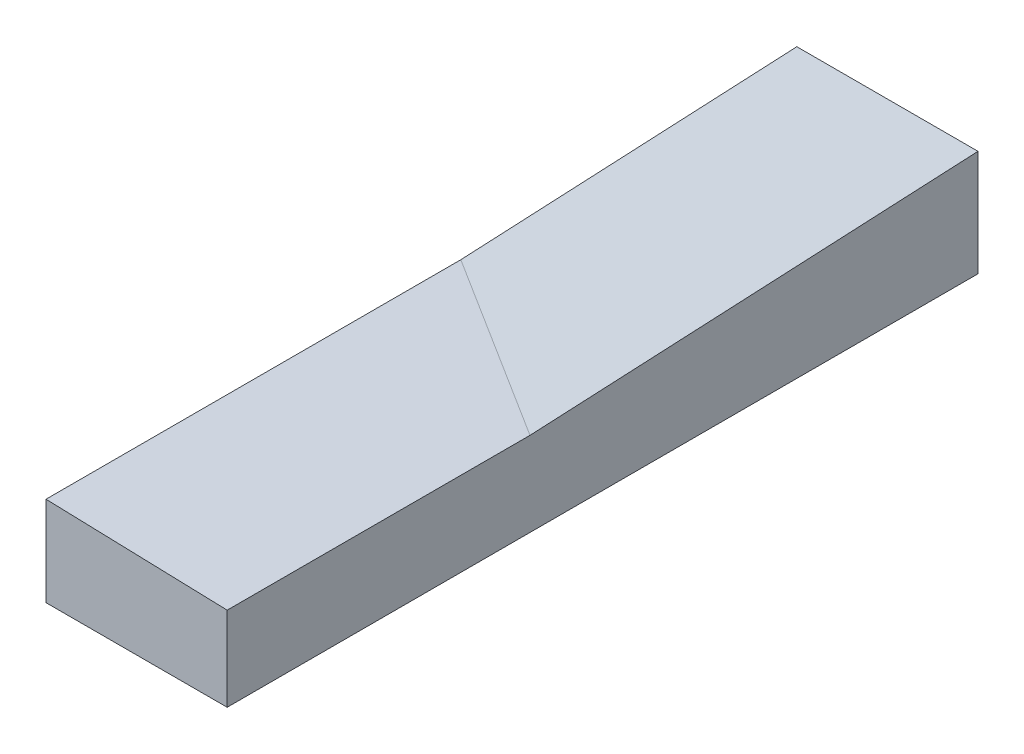
ISO-10303-21;
HEADER;
FILE_DESCRIPTION(('STEP AP214'),'2;1');
FILE_NAME('part.step','',(''),(''),'','','');
FILE_SCHEMA(('AUTOMOTIVE_DESIGN { 1 0 10303 214 1 1 1 1 }'));
ENDSEC;
DATA;
#1=APPLICATION_CONTEXT('core data for automotive mechanical design processes');
#2=APPLICATION_PROTOCOL_DEFINITION('international standard','automotive_design',2000,#1);
#3=PRODUCT_CONTEXT('',#1,'mechanical');
#4=PRODUCT('Part','Part','',(#3));
#5=PRODUCT_RELATED_PRODUCT_CATEGORY('part','',(#4));
#6=PRODUCT_DEFINITION_FORMATION('','',#4);
#7=PRODUCT_DEFINITION_CONTEXT('part definition',#1,'design');
#8=PRODUCT_DEFINITION('design','',#6,#7);
#9=PRODUCT_DEFINITION_SHAPE('','',#8);
#10=(LENGTH_UNIT() NAMED_UNIT(*) SI_UNIT(.MILLI.,.METRE.));
#11=(NAMED_UNIT(*) PLANE_ANGLE_UNIT() SI_UNIT($,.RADIAN.));
#12=(NAMED_UNIT(*) SI_UNIT($,.STERADIAN.) SOLID_ANGLE_UNIT());
#13=UNCERTAINTY_MEASURE_WITH_UNIT(LENGTH_MEASURE(1.E-05),#10,'distance_accuracy_value','');
#14=(GEOMETRIC_REPRESENTATION_CONTEXT(3) GLOBAL_UNCERTAINTY_ASSIGNED_CONTEXT((#13)) GLOBAL_UNIT_ASSIGNED_CONTEXT((#10,
#11,#12)) REPRESENTATION_CONTEXT('',''));
#15=CARTESIAN_POINT('',(0.,0.,0.));
#16=DIRECTION('',(0.,0.,1.));
#17=DIRECTION('',(1.,0.,0.));
#18=AXIS2_PLACEMENT_3D('',#15,#16,#17);
#19=CARTESIAN_POINT('',(144.78,0.,0.));
#20=DIRECTION('',(-1.,0.,0.));
#21=DIRECTION('',(0.,0.,1.));
#22=AXIS2_PLACEMENT_3D('',#19,#20,#21);
#23=PLANE('',#22);
#24=DIRECTION('',(0.,0.,1.));
#25=VECTOR('',#24,1.);
#26=CARTESIAN_POINT('',(144.78,65.4627272727274,-584.2));
#27=LINE('',#26,#25);
#28=CARTESIAN_POINT('',(144.78,65.4627272727274,-235.619636363636));
#29=VERTEX_POINT('',#28);
#30=CARTESIAN_POINT('',(144.78,65.4627272727274,0.));
#31=VERTEX_POINT('',#30);
#32=EDGE_CURVE('E109',#29,#31,#27,.T.);
#33=ORIENTED_EDGE('',*,*,#32,.T.);
#34=DIRECTION('',(0.,1.,0.));
#35=VECTOR('',#34,1.);
#36=CARTESIAN_POINT('',(144.78,0.,0.));
#37=LINE('',#36,#35);
#38=CARTESIAN_POINT('',(144.78,0.,0.));
#39=VERTEX_POINT('',#38);
#40=EDGE_CURVE('E107',#39,#31,#37,.T.);
#41=ORIENTED_EDGE('',*,*,#40,.F.);
#42=DIRECTION('',(0.,0.,-1.));
#43=VECTOR('',#42,1.);
#44=CARTESIAN_POINT('',(144.78,0.,-584.2));
#45=LINE('',#44,#43);
#46=CARTESIAN_POINT('',(144.78,0.,-584.2));
#47=VERTEX_POINT('',#46);
#48=EDGE_CURVE('E103',#39,#47,#45,.T.);
#49=ORIENTED_EDGE('',*,*,#48,.T.);
#50=DIRECTION('',(0.,1.,0.));
#51=VECTOR('',#50,1.);
#52=CARTESIAN_POINT('',(144.78,0.,-584.2));
#53=LINE('',#52,#51);
#54=CARTESIAN_POINT('',(144.78,82.55,-584.2));
#55=VERTEX_POINT('',#54);
#56=EDGE_CURVE('E95',#47,#55,#53,.T.);
#57=ORIENTED_EDGE('',*,*,#56,.T.);
#58=DIRECTION('',(0.,-0.0489608186254638,0.998800699959469));
#59=VECTOR('',#58,1.);
#60=CARTESIAN_POINT('',(144.78,82.55,-584.2));
#61=LINE('',#60,#59);
#62=EDGE_CURVE('E129',#55,#29,#61,.T.);
#63=ORIENTED_EDGE('',*,*,#62,.T.);
#64=EDGE_LOOP('',(#33,#41,#49,#57,#63));
#65=FACE_BOUND('',#64,.T.);
#66=ADVANCED_FACE('F42',(#65),#23,.F.);
#67=CARTESIAN_POINT('',(3.80999999999998,0.,0.));
#68=DIRECTION('',(-1.,0.,0.));
#69=DIRECTION('',(0.,0.,1.));
#70=AXIS2_PLACEMENT_3D('',#67,#68,#69);
#71=PLANE('',#70);
#72=DIRECTION('',(0.,0.,1.));
#73=VECTOR('',#72,1.);
#74=CARTESIAN_POINT('',(3.80999999999998,69.7345454545455,-584.2));
#75=LINE('',#74,#73);
#76=CARTESIAN_POINT('',(3.80999999999995,69.7345454545455,-322.764727272727));
#77=VERTEX_POINT('',#76);
#78=CARTESIAN_POINT('',(3.80999999999998,69.7345454545455,0.));
#79=VERTEX_POINT('',#78);
#80=EDGE_CURVE('E136',#77,#79,#75,.T.);
#81=ORIENTED_EDGE('',*,*,#80,.F.);
#82=DIRECTION('',(0.,-0.0489608186254638,0.998800699959469));
#83=VECTOR('',#82,1.);
#84=CARTESIAN_POINT('',(3.80999999999998,82.55,-584.2));
#85=LINE('',#84,#83);
#86=CARTESIAN_POINT('',(3.80999999999998,82.55,-584.2));
#87=VERTEX_POINT('',#86);
#88=EDGE_CURVE('E52',#87,#77,#85,.T.);
#89=ORIENTED_EDGE('',*,*,#88,.F.);
#90=DIRECTION('',(0.,1.,0.));
#91=VECTOR('',#90,1.);
#92=CARTESIAN_POINT('',(3.80999999999998,0.,-584.2));
#93=LINE('',#92,#91);
#94=CARTESIAN_POINT('',(3.80999999999998,0.,-584.2));
#95=VERTEX_POINT('',#94);
#96=EDGE_CURVE('E114',#95,#87,#93,.T.);
#97=ORIENTED_EDGE('',*,*,#96,.F.);
#98=DIRECTION('',(0.,0.,-1.));
#99=VECTOR('',#98,1.);
#100=CARTESIAN_POINT('',(3.80999999999998,0.,-584.2));
#101=LINE('',#100,#99);
#102=CARTESIAN_POINT('',(3.80999999999998,0.,0.));
#103=VERTEX_POINT('',#102);
#104=EDGE_CURVE('E112',#103,#95,#101,.T.);
#105=ORIENTED_EDGE('',*,*,#104,.F.);
#106=DIRECTION('',(0.,1.,0.));
#107=VECTOR('',#106,1.);
#108=CARTESIAN_POINT('',(3.80999999999998,0.,0.));
#109=LINE('',#108,#107);
#110=EDGE_CURVE('E11',#103,#79,#109,.T.);
#111=ORIENTED_EDGE('',*,*,#110,.T.);
#112=EDGE_LOOP('',(#81,#89,#97,#105,#111));
#113=FACE_BOUND('',#112,.T.);
#114=ADVANCED_FACE('F149',(#113),#71,.T.);
#115=CARTESIAN_POINT('',(-419.1,82.55,-584.2));
#116=DIRECTION('',(0.0302891266407689,0.999541179145381,0.));
#117=DIRECTION('',(-0.999541179145382,0.030289126640769,0.));
#118=AXIS2_PLACEMENT_3D('',#115,#116,#117);
#119=PLANE('',#118);
#120=ORIENTED_EDGE('',*,*,#32,.F.);
#121=DIRECTION('',(0.850312150745116,-0.025767034871064,0.525647511369709));
#122=VECTOR('',#121,1.);
#123=CARTESIAN_POINT('',(-419.1,82.55,-584.2));
#124=LINE('',#123,#122);
#125=EDGE_CURVE('E119',#77,#29,#124,.T.);
#126=ORIENTED_EDGE('',*,*,#125,.F.);
#127=ORIENTED_EDGE('',*,*,#80,.T.);
#128=DIRECTION('',(-0.999541179145381,0.030289126640769,0.));
#129=VECTOR('',#128,1.);
#130=CARTESIAN_POINT('',(-419.1,82.55,0.));
#131=LINE('',#130,#129);
#132=EDGE_CURVE('E68',#31,#79,#131,.T.);
#133=ORIENTED_EDGE('',*,*,#132,.F.);
#134=EDGE_LOOP('',(#120,#126,#127,#133));
#135=FACE_BOUND('',#134,.T.);
#136=ADVANCED_FACE('F148',(#135),#119,.T.);
#137=CARTESIAN_POINT('',(-943.794471192522,82.55,-584.2));
#138=DIRECTION('',(0.,0.998800699959469,0.0489608186254638));
#139=DIRECTION('',(0.,-0.0489608186254638,0.998800699959469));
#140=AXIS2_PLACEMENT_3D('',#137,#138,#139);
#141=PLANE('',#140);
#142=ORIENTED_EDGE('',*,*,#62,.F.);
#143=DIRECTION('',(1.,0.,0.));
#144=VECTOR('',#143,1.);
#145=CARTESIAN_POINT('',(-943.794471192522,82.55,-584.2));
#146=LINE('',#145,#144);
#147=EDGE_CURVE('E100',#87,#55,#146,.T.);
#148=ORIENTED_EDGE('',*,*,#147,.F.);
#149=ORIENTED_EDGE('',*,*,#88,.T.);
#150=ORIENTED_EDGE('',*,*,#125,.T.);
#151=EDGE_LOOP('',(#142,#148,#149,#150));
#152=FACE_BOUND('',#151,.T.);
#153=ADVANCED_FACE('F144',(#152),#141,.T.);
#154=CARTESIAN_POINT('',(-419.1,0.,-584.2));
#155=DIRECTION('',(0.,-1.,0.));
#156=DIRECTION('',(0.,0.,-1.));
#157=AXIS2_PLACEMENT_3D('',#154,#155,#156);
#158=PLANE('',#157);
#159=ORIENTED_EDGE('',*,*,#48,.F.);
#160=DIRECTION('',(1.,0.,0.));
#161=VECTOR('',#160,1.);
#162=CARTESIAN_POINT('',(-419.1,0.,0.));
#163=LINE('',#162,#161);
#164=EDGE_CURVE('E60',#103,#39,#163,.T.);
#165=ORIENTED_EDGE('',*,*,#164,.F.);
#166=ORIENTED_EDGE('',*,*,#104,.T.);
#167=DIRECTION('',(1.,0.,0.));
#168=VECTOR('',#167,1.);
#169=CARTESIAN_POINT('',(-419.1,0.,-584.2));
#170=LINE('',#169,#168);
#171=EDGE_CURVE('E46',#95,#47,#170,.T.);
#172=ORIENTED_EDGE('',*,*,#171,.T.);
#173=EDGE_LOOP('',(#159,#165,#166,#172));
#174=FACE_BOUND('',#173,.T.);
#175=ADVANCED_FACE('F111',(#174),#158,.T.);
#176=CARTESIAN_POINT('',(0.,0.,-584.2));
#177=DIRECTION('',(0.,0.,-1.));
#178=DIRECTION('',(-1.,0.,0.));
#179=AXIS2_PLACEMENT_3D('',#176,#177,#178);
#180=PLANE('',#179);
#181=ORIENTED_EDGE('',*,*,#56,.F.);
#182=ORIENTED_EDGE('',*,*,#171,.F.);
#183=ORIENTED_EDGE('',*,*,#96,.T.);
#184=ORIENTED_EDGE('',*,*,#147,.T.);
#185=EDGE_LOOP('',(#181,#182,#183,#184));
#186=FACE_BOUND('',#185,.T.);
#187=ADVANCED_FACE('F97',(#186),#180,.T.);
#188=CARTESIAN_POINT('',(0.,0.,0.));
#189=DIRECTION('',(0.,0.,-1.));
#190=DIRECTION('',(-1.,0.,0.));
#191=AXIS2_PLACEMENT_3D('',#188,#189,#190);
#192=PLANE('',#191);
#193=ORIENTED_EDGE('',*,*,#164,.T.);
#194=ORIENTED_EDGE('',*,*,#40,.T.);
#195=ORIENTED_EDGE('',*,*,#132,.T.);
#196=ORIENTED_EDGE('',*,*,#110,.F.);
#197=EDGE_LOOP('',(#193,#194,#195,#196));
#198=FACE_BOUND('',#197,.T.);
#199=ADVANCED_FACE('F44',(#198),#192,.F.);
#200=CLOSED_SHELL('',(#66,#114,#136,#153,#175,#187,#199));
#201=MANIFOLD_SOLID_BREP('B2',#200);
#202=ADVANCED_BREP_SHAPE_REPRESENTATION('',(#18,#201),#14);
#203=SHAPE_DEFINITION_REPRESENTATION(#9,#202);
ENDSEC;
END-ISO-10303-21;
